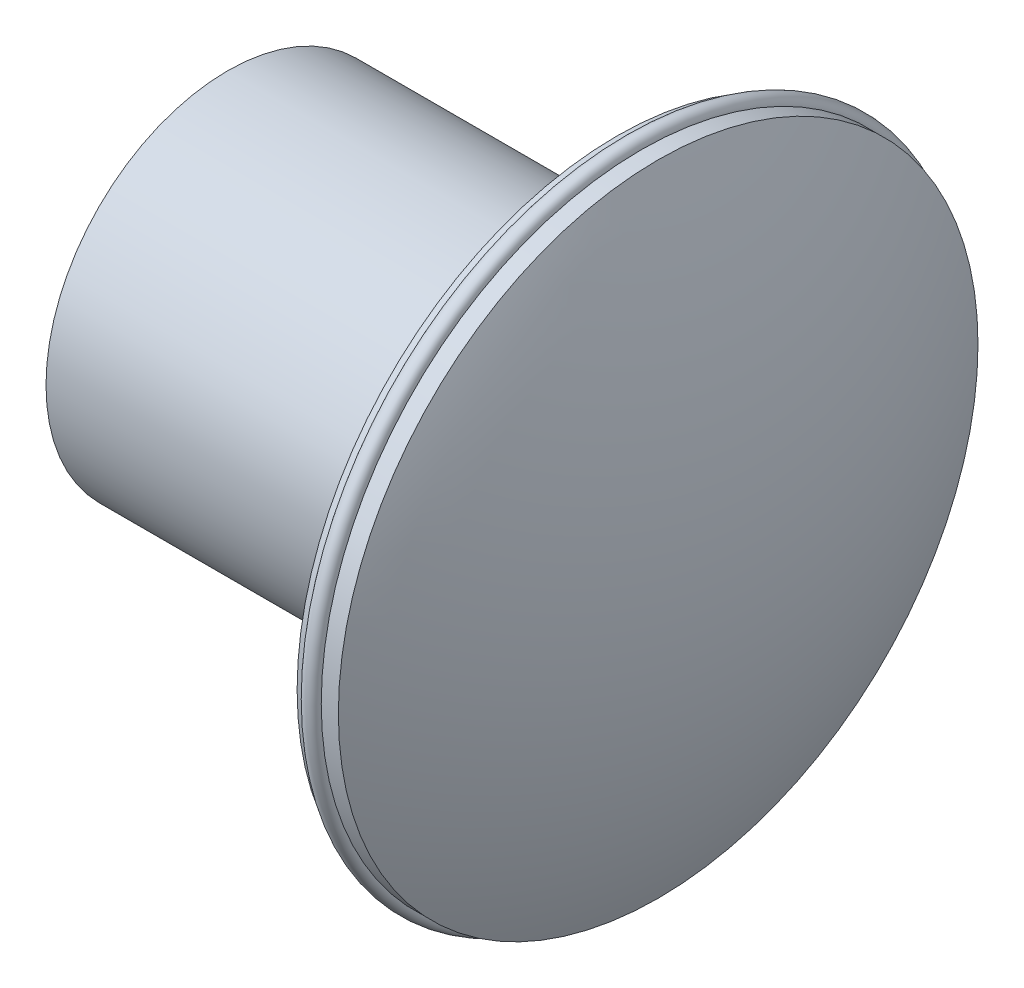
ISO-10303-21;
HEADER;
FILE_DESCRIPTION(('STEP AP214'),'2;1');
FILE_NAME('part.step','',(''),(''),'','','');
FILE_SCHEMA(('AUTOMOTIVE_DESIGN { 1 0 10303 214 1 1 1 1 }'));
ENDSEC;
DATA;
#1=APPLICATION_CONTEXT('core data for automotive mechanical design processes');
#2=APPLICATION_PROTOCOL_DEFINITION('international standard','automotive_design',2000,#1);
#3=PRODUCT_CONTEXT('',#1,'mechanical');
#4=PRODUCT('Part','Part','',(#3));
#5=PRODUCT_RELATED_PRODUCT_CATEGORY('part','',(#4));
#6=PRODUCT_DEFINITION_FORMATION('','',#4);
#7=PRODUCT_DEFINITION_CONTEXT('part definition',#1,'design');
#8=PRODUCT_DEFINITION('design','',#6,#7);
#9=PRODUCT_DEFINITION_SHAPE('','',#8);
#10=(LENGTH_UNIT() NAMED_UNIT(*) SI_UNIT(.MILLI.,.METRE.));
#11=(NAMED_UNIT(*) PLANE_ANGLE_UNIT() SI_UNIT($,.RADIAN.));
#12=(NAMED_UNIT(*) SI_UNIT($,.STERADIAN.) SOLID_ANGLE_UNIT());
#13=UNCERTAINTY_MEASURE_WITH_UNIT(LENGTH_MEASURE(1.E-05),#10,'distance_accuracy_value','');
#14=(GEOMETRIC_REPRESENTATION_CONTEXT(3) GLOBAL_UNCERTAINTY_ASSIGNED_CONTEXT((#13)) GLOBAL_UNIT_ASSIGNED_CONTEXT((#10,
#11,#12)) REPRESENTATION_CONTEXT('',''));
#15=CARTESIAN_POINT('',(0.,0.,0.));
#16=DIRECTION('',(0.,0.,1.));
#17=DIRECTION('',(1.,0.,0.));
#18=AXIS2_PLACEMENT_3D('',#15,#16,#17);
#19=CARTESIAN_POINT('',(0.,16.064574588347,0.));
#20=DIRECTION('',(1.,0.,0.));
#21=DIRECTION('',(0.,0.,-1.));
#22=AXIS2_PLACEMENT_3D('',#19,#20,#21);
#23=PLANE('',#22);
#24=CARTESIAN_POINT('',(0.,0.,0.));
#25=DIRECTION('',(-1.,0.,0.));
#26=DIRECTION('',(0.,0.,1.));
#27=AXIS2_PLACEMENT_3D('',#24,#25,#26);
#28=CIRCLE('',#27,16.064574588347);
#29=CARTESIAN_POINT('',(0.,0.,16.064574588347));
#30=VERTEX_POINT('',#29);
#31=EDGE_CURVE('E10',#30,#30,#28,.T.);
#32=ORIENTED_EDGE('',*,*,#31,.T.);
#33=EDGE_LOOP('',(#32));
#34=FACE_BOUND('',#33,.T.);
#35=ADVANCED_FACE('F34',(#34),#23,.F.);
#36=CARTESIAN_POINT('',(-76.840094259018,0.,0.));
#37=DIRECTION('',(-1.,0.,0.));
#38=DIRECTION('',(0.,0.,1.));
#39=AXIS2_PLACEMENT_3D('',#36,#37,#38);
#40=CYLINDRICAL_SURFACE('',#39,16.064574588347);
#41=ORIENTED_EDGE('',*,*,#31,.F.);
#42=EDGE_LOOP('',(#41));
#43=FACE_BOUND('',#42,.T.);
#44=CARTESIAN_POINT('',(26.831261230406,0.,0.));
#45=DIRECTION('',(-1.,0.,0.));
#46=DIRECTION('',(0.,0.,1.));
#47=AXIS2_PLACEMENT_3D('',#44,#45,#46);
#48=CIRCLE('',#47,16.064574588347);
#49=CARTESIAN_POINT('',(26.831261230406,0.,16.064574588347));
#50=VERTEX_POINT('',#49);
#51=EDGE_CURVE('E40',#50,#50,#48,.T.);
#52=ORIENTED_EDGE('',*,*,#51,.T.);
#53=EDGE_LOOP('',(#52));
#54=FACE_BOUND('',#53,.T.);
#55=ADVANCED_FACE('F72',(#43,#54),#40,.T.);
#56=CARTESIAN_POINT('',(34.451261230406,0.,0.));
#57=DIRECTION('',(1.,0.,0.));
#58=DIRECTION('',(0.,0.,-1.));
#59=AXIS2_PLACEMENT_3D('',#56,#57,#58);
#60=CONICAL_SURFACE('',#59,28.2977403079128,1.01371084183016);
#61=ORIENTED_EDGE('',*,*,#51,.F.);
#62=EDGE_LOOP('',(#61));
#63=FACE_BOUND('',#62,.T.);
#64=CARTESIAN_POINT('',(34.451261230406,0.,0.));
#65=DIRECTION('',(-1.,0.,0.));
#66=DIRECTION('',(0.,0.,1.));
#67=AXIS2_PLACEMENT_3D('',#64,#65,#66);
#68=CIRCLE('',#67,28.2977403079128);
#69=CARTESIAN_POINT('',(34.451261230406,0.,28.2977403079128));
#70=VERTEX_POINT('',#69);
#71=EDGE_CURVE('E44',#70,#70,#68,.T.);
#72=ORIENTED_EDGE('',*,*,#71,.T.);
#73=EDGE_LOOP('',(#72));
#74=FACE_BOUND('',#73,.T.);
#75=ADVANCED_FACE('F76',(#63,#74),#60,.T.);
#76=CARTESIAN_POINT('',(-76.840094259018,0.,0.));
#77=DIRECTION('',(-1.,0.,0.));
#78=DIRECTION('',(0.,0.,1.));
#79=AXIS2_PLACEMENT_3D('',#76,#77,#78);
#80=CYLINDRICAL_SURFACE('',#79,28.2977403079128);
#81=ORIENTED_EDGE('',*,*,#71,.F.);
#82=EDGE_LOOP('',(#81));
#83=FACE_BOUND('',#82,.T.);
#84=CARTESIAN_POINT('',(35.1186246068256,0.,0.));
#85=DIRECTION('',(-1.,0.,0.));
#86=DIRECTION('',(0.,0.,1.));
#87=AXIS2_PLACEMENT_3D('',#84,#85,#86);
#88=CIRCLE('',#87,28.2977403079128);
#89=CARTESIAN_POINT('',(35.1186246068256,0.,28.2977403079128));
#90=VERTEX_POINT('',#89);
#91=EDGE_CURVE('E48',#90,#90,#88,.T.);
#92=ORIENTED_EDGE('',*,*,#91,.T.);
#93=EDGE_LOOP('',(#92));
#94=FACE_BOUND('',#93,.T.);
#95=ADVANCED_FACE('F81',(#83,#94),#80,.T.);
#96=CARTESIAN_POINT('',(35.8520442802325,0.,0.));
#97=DIRECTION('',(-1.,0.,0.));
#98=DIRECTION('',(0.,0.,1.));
#99=AXIS2_PLACEMENT_3D('',#96,#97,#98);
#100=TOROIDAL_SURFACE('',#99,28.2977403079128,0.733419673406881);
#101=ORIENTED_EDGE('',*,*,#91,.F.);
#102=EDGE_LOOP('',(#101));
#103=FACE_BOUND('',#102,.T.);
#104=CARTESIAN_POINT('',(36.5854639536394,0.,0.));
#105=DIRECTION('',(-1.,0.,0.));
#106=DIRECTION('',(0.,0.,1.));
#107=AXIS2_PLACEMENT_3D('',#104,#105,#106);
#108=CIRCLE('',#107,28.2977403079128);
#109=CARTESIAN_POINT('',(36.5854639536394,0.,28.2977403079128));
#110=VERTEX_POINT('',#109);
#111=EDGE_CURVE('E53',#110,#110,#108,.T.);
#112=ORIENTED_EDGE('',*,*,#111,.T.);
#113=EDGE_LOOP('',(#112));
#114=FACE_BOUND('',#113,.T.);
#115=ADVANCED_FACE('F68',(#103,#114),#100,.T.);
#116=CARTESIAN_POINT('',(-76.840094259018,0.,0.));
#117=DIRECTION('',(-1.,0.,0.));
#118=DIRECTION('',(0.,0.,1.));
#119=AXIS2_PLACEMENT_3D('',#116,#117,#118);
#120=CYLINDRICAL_SURFACE('',#119,28.2977403079128);
#121=ORIENTED_EDGE('',*,*,#111,.F.);
#122=EDGE_LOOP('',(#121));
#123=FACE_BOUND('',#122,.T.);
#124=CARTESIAN_POINT('',(38.1,0.,0.));
#125=DIRECTION('',(-1.,0.,0.));
#126=DIRECTION('',(0.,0.,1.));
#127=AXIS2_PLACEMENT_3D('',#124,#125,#126);
#128=CIRCLE('',#127,28.2977403079128);
#129=CARTESIAN_POINT('',(38.1,0.,28.2977403079128));
#130=VERTEX_POINT('',#129);
#131=EDGE_CURVE('E56',#130,#130,#128,.T.);
#132=ORIENTED_EDGE('',*,*,#131,.T.);
#133=EDGE_LOOP('',(#132));
#134=FACE_BOUND('',#133,.T.);
#135=ADVANCED_FACE('F60',(#123,#134),#120,.T.);
#136=CARTESIAN_POINT('',(-21.7771343727617,0.,0.));
#137=DIRECTION('',(-1.,0.,0.));
#138=DIRECTION('',(0.,1.,0.));
#139=AXIS2_PLACEMENT_3D('',#136,#137,#138);
#140=SPHERICAL_SURFACE('',#139,66.2271343727617);
#141=ORIENTED_EDGE('',*,*,#131,.F.);
#142=EDGE_LOOP('',(#141));
#143=FACE_BOUND('',#142,.T.);
#144=ADVANCED_FACE('F62',(#143),#140,.T.);
#145=CLOSED_SHELL('',(#35,#55,#75,#95,#115,#135,#144));
#146=MANIFOLD_SOLID_BREP('B2',#145);
#147=ADVANCED_BREP_SHAPE_REPRESENTATION('',(#18,#146),#14);
#148=SHAPE_DEFINITION_REPRESENTATION(#9,#147);
ENDSEC;
END-ISO-10303-21;
